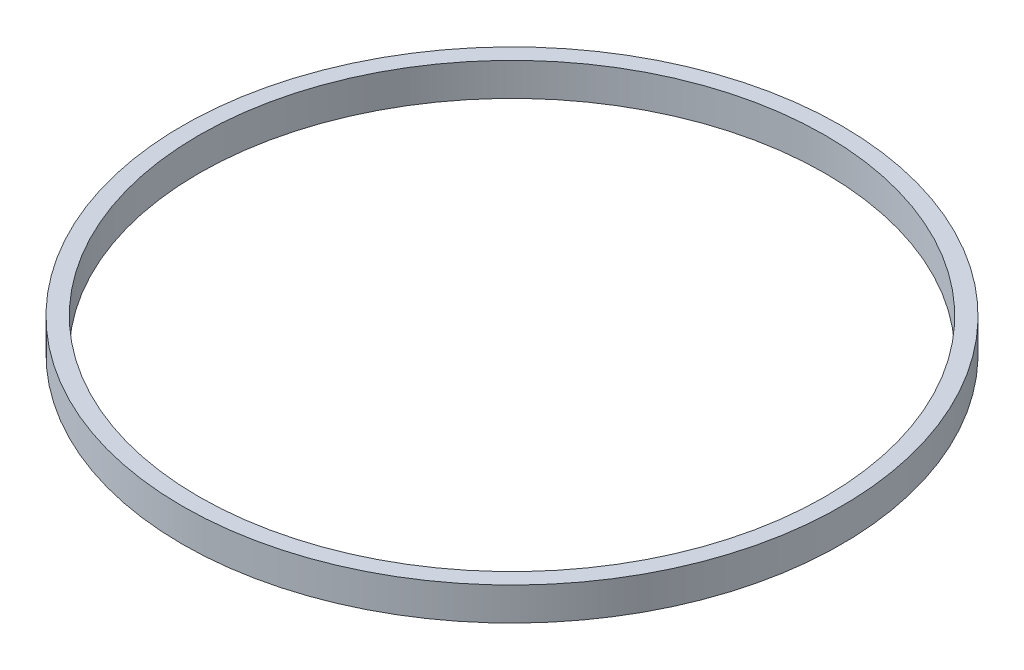
ISO-10303-21;
HEADER;
FILE_DESCRIPTION(('STEP AP214'),'2;1');
FILE_NAME('part.step','',(''),(''),'','','');
FILE_SCHEMA(('AUTOMOTIVE_DESIGN { 1 0 10303 214 1 1 1 1 }'));
ENDSEC;
DATA;
#1=APPLICATION_CONTEXT('core data for automotive mechanical design processes');
#2=APPLICATION_PROTOCOL_DEFINITION('international standard','automotive_design',2000,#1);
#3=PRODUCT_CONTEXT('',#1,'mechanical');
#4=PRODUCT('Part','Part','',(#3));
#5=PRODUCT_RELATED_PRODUCT_CATEGORY('part','',(#4));
#6=PRODUCT_DEFINITION_FORMATION('','',#4);
#7=PRODUCT_DEFINITION_CONTEXT('part definition',#1,'design');
#8=PRODUCT_DEFINITION('design','',#6,#7);
#9=PRODUCT_DEFINITION_SHAPE('','',#8);
#10=(LENGTH_UNIT() NAMED_UNIT(*) SI_UNIT(.MILLI.,.METRE.));
#11=(NAMED_UNIT(*) PLANE_ANGLE_UNIT() SI_UNIT($,.RADIAN.));
#12=(NAMED_UNIT(*) SI_UNIT($,.STERADIAN.) SOLID_ANGLE_UNIT());
#13=UNCERTAINTY_MEASURE_WITH_UNIT(LENGTH_MEASURE(1.E-05),#10,'distance_accuracy_value','');
#14=(GEOMETRIC_REPRESENTATION_CONTEXT(3) GLOBAL_UNCERTAINTY_ASSIGNED_CONTEXT((#13)) GLOBAL_UNIT_ASSIGNED_CONTEXT((#10,
#11,#12)) REPRESENTATION_CONTEXT('',''));
#15=CARTESIAN_POINT('',(0.,0.,0.));
#16=DIRECTION('',(0.,0.,1.));
#17=DIRECTION('',(1.,0.,0.));
#18=AXIS2_PLACEMENT_3D('',#15,#16,#17);
#19=CARTESIAN_POINT('',(0.,2.54,0.));
#20=DIRECTION('',(0.,1.,0.));
#21=DIRECTION('',(0.,0.,1.));
#22=AXIS2_PLACEMENT_3D('',#19,#20,#21);
#23=PLANE('',#22);
#24=CARTESIAN_POINT('',(0.,2.54,0.));
#25=DIRECTION('',(0.,1.,0.));
#26=DIRECTION('',(0.,0.,1.));
#27=AXIS2_PLACEMENT_3D('',#24,#25,#26);
#28=CIRCLE('',#27,25.4);
#29=CARTESIAN_POINT('',(0.,2.54,25.4));
#30=VERTEX_POINT('',#29);
#31=EDGE_CURVE('E10',#30,#30,#28,.T.);
#32=ORIENTED_EDGE('',*,*,#31,.T.);
#33=EDGE_LOOP('',(#32));
#34=FACE_BOUND('',#33,.T.);
#35=CARTESIAN_POINT('',(0.,2.54,0.));
#36=DIRECTION('',(0.,1.,0.));
#37=DIRECTION('',(0.,0.,1.));
#38=AXIS2_PLACEMENT_3D('',#35,#36,#37);
#39=CIRCLE('',#38,24.13);
#40=CARTESIAN_POINT('',(0.,2.54,24.13));
#41=VERTEX_POINT('',#40);
#42=EDGE_CURVE('E42',#41,#41,#39,.T.);
#43=ORIENTED_EDGE('',*,*,#42,.F.);
#44=EDGE_LOOP('',(#43));
#45=FACE_BOUND('',#44,.T.);
#46=ADVANCED_FACE('F31',(#34,#45),#23,.T.);
#47=CARTESIAN_POINT('',(0.,0.,0.));
#48=DIRECTION('',(0.,1.,0.));
#49=DIRECTION('',(0.,0.,1.));
#50=AXIS2_PLACEMENT_3D('',#47,#48,#49);
#51=PLANE('',#50);
#52=CARTESIAN_POINT('',(0.,0.,0.));
#53=DIRECTION('',(0.,1.,0.));
#54=DIRECTION('',(0.,0.,1.));
#55=AXIS2_PLACEMENT_3D('',#52,#53,#54);
#56=CIRCLE('',#55,25.4);
#57=CARTESIAN_POINT('',(0.,0.,25.4));
#58=VERTEX_POINT('',#57);
#59=EDGE_CURVE('E35',#58,#58,#56,.T.);
#60=ORIENTED_EDGE('',*,*,#59,.F.);
#61=EDGE_LOOP('',(#60));
#62=FACE_BOUND('',#61,.T.);
#63=CARTESIAN_POINT('',(0.,0.,0.));
#64=DIRECTION('',(0.,1.,0.));
#65=DIRECTION('',(0.,0.,1.));
#66=AXIS2_PLACEMENT_3D('',#63,#64,#65);
#67=CIRCLE('',#66,24.13);
#68=CARTESIAN_POINT('',(0.,0.,24.13));
#69=VERTEX_POINT('',#68);
#70=EDGE_CURVE('E44',#69,#69,#67,.T.);
#71=ORIENTED_EDGE('',*,*,#70,.T.);
#72=EDGE_LOOP('',(#71));
#73=FACE_BOUND('',#72,.T.);
#74=ADVANCED_FACE('F54',(#62,#73),#51,.F.);
#75=CARTESIAN_POINT('',(0.,2.54,0.));
#76=DIRECTION('',(0.,-1.,0.));
#77=DIRECTION('',(0.,0.,-1.));
#78=AXIS2_PLACEMENT_3D('',#75,#76,#77);
#79=CYLINDRICAL_SURFACE('',#78,25.4);
#80=ORIENTED_EDGE('',*,*,#31,.F.);
#81=EDGE_LOOP('',(#80));
#82=FACE_BOUND('',#81,.T.);
#83=ORIENTED_EDGE('',*,*,#59,.T.);
#84=EDGE_LOOP('',(#83));
#85=FACE_BOUND('',#84,.T.);
#86=ADVANCED_FACE('F33',(#82,#85),#79,.T.);
#87=CARTESIAN_POINT('',(0.,2.54,0.));
#88=DIRECTION('',(0.,-1.,0.));
#89=DIRECTION('',(0.,0.,-1.));
#90=AXIS2_PLACEMENT_3D('',#87,#88,#89);
#91=CYLINDRICAL_SURFACE('',#90,24.13);
#92=ORIENTED_EDGE('',*,*,#42,.T.);
#93=EDGE_LOOP('',(#92));
#94=FACE_BOUND('',#93,.T.);
#95=ORIENTED_EDGE('',*,*,#70,.F.);
#96=EDGE_LOOP('',(#95));
#97=FACE_BOUND('',#96,.T.);
#98=ADVANCED_FACE('F50',(#94,#97),#91,.F.);
#99=CLOSED_SHELL('',(#46,#74,#86,#98));
#100=MANIFOLD_SOLID_BREP('B2',#99);
#101=ADVANCED_BREP_SHAPE_REPRESENTATION('',(#18,#100),#14);
#102=SHAPE_DEFINITION_REPRESENTATION(#9,#101);
ENDSEC;
END-ISO-10303-21;
